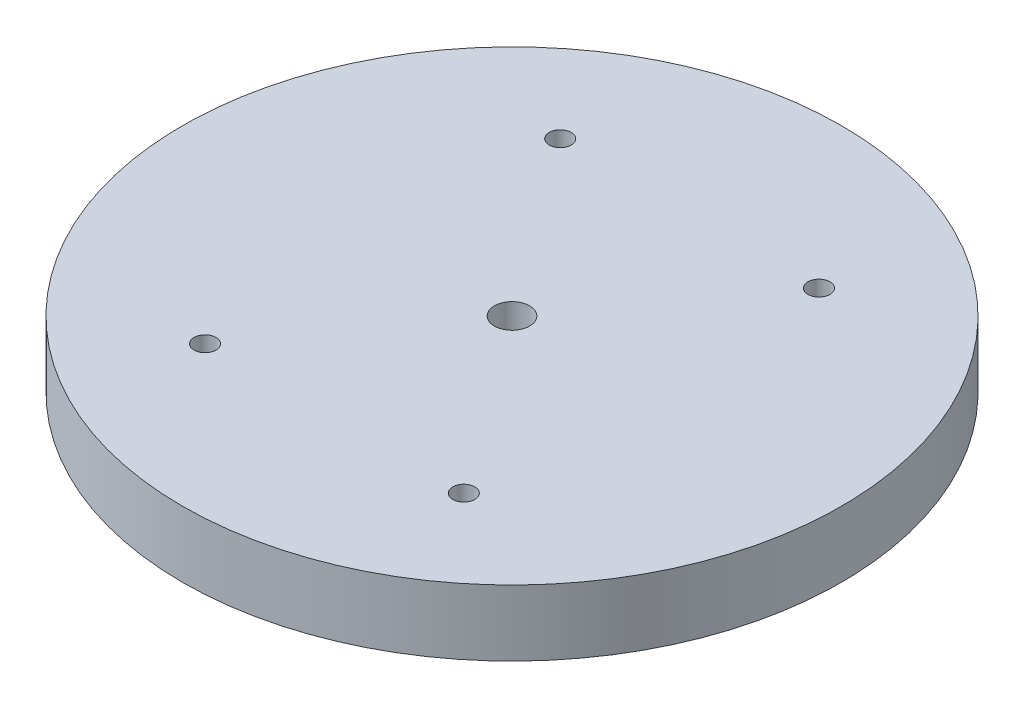
ISO-10303-21;
HEADER;
FILE_DESCRIPTION(('STEP AP214'),'2;1');
FILE_NAME('part.step','',(''),(''),'','','');
FILE_SCHEMA(('AUTOMOTIVE_DESIGN { 1 0 10303 214 1 1 1 1 }'));
ENDSEC;
DATA;
#1=APPLICATION_CONTEXT('core data for automotive mechanical design processes');
#2=APPLICATION_PROTOCOL_DEFINITION('international standard','automotive_design',2000,#1);
#3=PRODUCT_CONTEXT('',#1,'mechanical');
#4=PRODUCT('Part','Part','',(#3));
#5=PRODUCT_RELATED_PRODUCT_CATEGORY('part','',(#4));
#6=PRODUCT_DEFINITION_FORMATION('','',#4);
#7=PRODUCT_DEFINITION_CONTEXT('part definition',#1,'design');
#8=PRODUCT_DEFINITION('design','',#6,#7);
#9=PRODUCT_DEFINITION_SHAPE('','',#8);
#10=(LENGTH_UNIT() NAMED_UNIT(*) SI_UNIT(.MILLI.,.METRE.));
#11=(NAMED_UNIT(*) PLANE_ANGLE_UNIT() SI_UNIT($,.RADIAN.));
#12=(NAMED_UNIT(*) SI_UNIT($,.STERADIAN.) SOLID_ANGLE_UNIT());
#13=UNCERTAINTY_MEASURE_WITH_UNIT(LENGTH_MEASURE(1.E-05),#10,'distance_accuracy_value','');
#14=(GEOMETRIC_REPRESENTATION_CONTEXT(3) GLOBAL_UNCERTAINTY_ASSIGNED_CONTEXT((#13)) GLOBAL_UNIT_ASSIGNED_CONTEXT((#10,
#11,#12)) REPRESENTATION_CONTEXT('',''));
#15=CARTESIAN_POINT('',(0.,0.,0.));
#16=DIRECTION('',(0.,0.,1.));
#17=DIRECTION('',(1.,0.,0.));
#18=AXIS2_PLACEMENT_3D('',#15,#16,#17);
#19=CARTESIAN_POINT('',(0.,15.,0.));
#20=DIRECTION('',(0.,1.,0.));
#21=DIRECTION('',(0.,0.,1.));
#22=AXIS2_PLACEMENT_3D('',#19,#20,#21);
#23=PLANE('',#22);
#24=CARTESIAN_POINT('',(0.,15.,0.));
#25=DIRECTION('',(0.,1.,0.));
#26=DIRECTION('',(0.,0.,1.));
#27=AXIS2_PLACEMENT_3D('',#24,#25,#26);
#28=CIRCLE('',#27,4.);
#29=CARTESIAN_POINT('',(0.,15.,4.));
#30=VERTEX_POINT('',#29);
#31=EDGE_CURVE('E73',#30,#30,#28,.T.);
#32=ORIENTED_EDGE('',*,*,#31,.F.);
#33=EDGE_LOOP('',(#32));
#34=FACE_BOUND('',#33,.T.);
#35=CARTESIAN_POINT('',(-29.4435878552393,15.,40.4113243313159));
#36=DIRECTION('',(0.,1.,0.));
#37=DIRECTION('',(0.,0.,1.));
#38=AXIS2_PLACEMENT_3D('',#35,#36,#37);
#39=CIRCLE('',#38,2.5);
#40=CARTESIAN_POINT('',(-29.4435878552393,15.,42.9113243313159));
#41=VERTEX_POINT('',#40);
#42=EDGE_CURVE('E59',#41,#41,#39,.T.);
#43=ORIENTED_EDGE('',*,*,#42,.F.);
#44=EDGE_LOOP('',(#43));
#45=FACE_BOUND('',#44,.T.);
#46=CARTESIAN_POINT('',(29.4435878552393,15.,-40.4113243313159));
#47=DIRECTION('',(0.,1.,0.));
#48=DIRECTION('',(0.,0.,1.));
#49=AXIS2_PLACEMENT_3D('',#46,#47,#48);
#50=CIRCLE('',#49,2.50000000000001);
#51=CARTESIAN_POINT('',(29.4435878552393,15.,-37.9113243313159));
#52=VERTEX_POINT('',#51);
#53=EDGE_CURVE('E48',#52,#52,#50,.T.);
#54=ORIENTED_EDGE('',*,*,#53,.F.);
#55=EDGE_LOOP('',(#54));
#56=FACE_BOUND('',#55,.T.);
#57=CARTESIAN_POINT('',(0.,15.,0.));
#58=DIRECTION('',(0.,1.,0.));
#59=DIRECTION('',(0.,0.,1.));
#60=AXIS2_PLACEMENT_3D('',#57,#58,#59);
#61=CIRCLE('',#60,75.);
#62=CARTESIAN_POINT('',(0.,15.,75.));
#63=VERTEX_POINT('',#62);
#64=EDGE_CURVE('E10',#63,#63,#61,.T.);
#65=ORIENTED_EDGE('',*,*,#64,.T.);
#66=EDGE_LOOP('',(#65));
#67=FACE_BOUND('',#66,.T.);
#68=CARTESIAN_POINT('',(29.4435878552393,15.,40.4113243313159));
#69=DIRECTION('',(0.,1.,0.));
#70=DIRECTION('',(0.,0.,-1.));
#71=AXIS2_PLACEMENT_3D('',#68,#69,#70);
#72=CIRCLE('',#71,2.50000000000001);
#73=CARTESIAN_POINT('',(29.4435878552393,15.,37.9113243313159));
#74=VERTEX_POINT('',#73);
#75=EDGE_CURVE('E53',#74,#74,#72,.T.);
#76=ORIENTED_EDGE('',*,*,#75,.F.);
#77=EDGE_LOOP('',(#76));
#78=FACE_BOUND('',#77,.T.);
#79=CARTESIAN_POINT('',(-29.4435878552393,15.,-40.4113243313159));
#80=DIRECTION('',(0.,1.,0.));
#81=DIRECTION('',(0.,0.,-1.));
#82=AXIS2_PLACEMENT_3D('',#79,#80,#81);
#83=CIRCLE('',#82,2.5);
#84=CARTESIAN_POINT('',(-29.4435878552393,15.,-42.9113243313159));
#85=VERTEX_POINT('',#84);
#86=EDGE_CURVE('E65',#85,#85,#83,.T.);
#87=ORIENTED_EDGE('',*,*,#86,.F.);
#88=EDGE_LOOP('',(#87));
#89=FACE_BOUND('',#88,.T.);
#90=ADVANCED_FACE('F35',(#34,#45,#56,#67,#78,#89),#23,.T.);
#91=CARTESIAN_POINT('',(0.,0.,0.));
#92=DIRECTION('',(0.,1.,0.));
#93=DIRECTION('',(0.,0.,1.));
#94=AXIS2_PLACEMENT_3D('',#91,#92,#93);
#95=PLANE('',#94);
#96=CARTESIAN_POINT('',(0.,0.,0.));
#97=DIRECTION('',(0.,1.,0.));
#98=DIRECTION('',(0.,0.,1.));
#99=AXIS2_PLACEMENT_3D('',#96,#97,#98);
#100=CIRCLE('',#99,4.);
#101=CARTESIAN_POINT('',(0.,0.,4.));
#102=VERTEX_POINT('',#101);
#103=EDGE_CURVE('E39',#102,#102,#100,.T.);
#104=ORIENTED_EDGE('',*,*,#103,.T.);
#105=EDGE_LOOP('',(#104));
#106=FACE_BOUND('',#105,.T.);
#107=CARTESIAN_POINT('',(0.,0.,0.));
#108=DIRECTION('',(0.,1.,0.));
#109=DIRECTION('',(0.,0.,1.));
#110=AXIS2_PLACEMENT_3D('',#107,#108,#109);
#111=CIRCLE('',#110,75.);
#112=CARTESIAN_POINT('',(0.,0.,75.));
#113=VERTEX_POINT('',#112);
#114=EDGE_CURVE('E43',#113,#113,#111,.T.);
#115=ORIENTED_EDGE('',*,*,#114,.F.);
#116=EDGE_LOOP('',(#115));
#117=FACE_BOUND('',#116,.T.);
#118=CARTESIAN_POINT('',(29.4435878552393,0.,-40.4113243313159));
#119=DIRECTION('',(0.,1.,0.));
#120=DIRECTION('',(0.,0.,1.));
#121=AXIS2_PLACEMENT_3D('',#118,#119,#120);
#122=CIRCLE('',#121,2.50000000000001);
#123=CARTESIAN_POINT('',(29.4435878552393,0.,-37.9113243313159));
#124=VERTEX_POINT('',#123);
#125=EDGE_CURVE('E50',#124,#124,#122,.T.);
#126=ORIENTED_EDGE('',*,*,#125,.T.);
#127=EDGE_LOOP('',(#126));
#128=FACE_BOUND('',#127,.T.);
#129=CARTESIAN_POINT('',(29.4435878552393,0.,40.4113243313159));
#130=DIRECTION('',(0.,1.,0.));
#131=DIRECTION('',(0.,0.,-1.));
#132=AXIS2_PLACEMENT_3D('',#129,#130,#131);
#133=CIRCLE('',#132,2.50000000000001);
#134=CARTESIAN_POINT('',(29.4435878552393,0.,37.9113243313159));
#135=VERTEX_POINT('',#134);
#136=EDGE_CURVE('E56',#135,#135,#133,.T.);
#137=ORIENTED_EDGE('',*,*,#136,.T.);
#138=EDGE_LOOP('',(#137));
#139=FACE_BOUND('',#138,.T.);
#140=CARTESIAN_POINT('',(-29.4435878552393,0.,40.4113243313159));
#141=DIRECTION('',(0.,1.,0.));
#142=DIRECTION('',(0.,0.,1.));
#143=AXIS2_PLACEMENT_3D('',#140,#141,#142);
#144=CIRCLE('',#143,2.5);
#145=CARTESIAN_POINT('',(-29.4435878552393,0.,42.9113243313159));
#146=VERTEX_POINT('',#145);
#147=EDGE_CURVE('E62',#146,#146,#144,.T.);
#148=ORIENTED_EDGE('',*,*,#147,.T.);
#149=EDGE_LOOP('',(#148));
#150=FACE_BOUND('',#149,.T.);
#151=CARTESIAN_POINT('',(-29.4435878552393,0.,-40.4113243313159));
#152=DIRECTION('',(0.,1.,0.));
#153=DIRECTION('',(0.,0.,-1.));
#154=AXIS2_PLACEMENT_3D('',#151,#152,#153);
#155=CIRCLE('',#154,2.5);
#156=CARTESIAN_POINT('',(-29.4435878552393,0.,-42.9113243313159));
#157=VERTEX_POINT('',#156);
#158=EDGE_CURVE('E68',#157,#157,#155,.T.);
#159=ORIENTED_EDGE('',*,*,#158,.T.);
#160=EDGE_LOOP('',(#159));
#161=FACE_BOUND('',#160,.T.);
#162=ADVANCED_FACE('F80',(#106,#117,#128,#139,#150,#161),#95,.F.);
#163=CARTESIAN_POINT('',(0.,15.,0.));
#164=DIRECTION('',(0.,-1.,0.));
#165=DIRECTION('',(0.,0.,-1.));
#166=AXIS2_PLACEMENT_3D('',#163,#164,#165);
#167=CYLINDRICAL_SURFACE('',#166,75.);
#168=ORIENTED_EDGE('',*,*,#64,.F.);
#169=EDGE_LOOP('',(#168));
#170=FACE_BOUND('',#169,.T.);
#171=ORIENTED_EDGE('',*,*,#114,.T.);
#172=EDGE_LOOP('',(#171));
#173=FACE_BOUND('',#172,.T.);
#174=ADVANCED_FACE('F37',(#170,#173),#167,.T.);
#175=CARTESIAN_POINT('',(29.4435878552393,15.,-40.4113243313159));
#176=DIRECTION('',(0.,-1.,0.));
#177=DIRECTION('',(0.,0.,-1.));
#178=AXIS2_PLACEMENT_3D('',#175,#176,#177);
#179=CYLINDRICAL_SURFACE('',#178,2.50000000000001);
#180=ORIENTED_EDGE('',*,*,#53,.T.);
#181=EDGE_LOOP('',(#180));
#182=FACE_BOUND('',#181,.T.);
#183=ORIENTED_EDGE('',*,*,#125,.F.);
#184=EDGE_LOOP('',(#183));
#185=FACE_BOUND('',#184,.T.);
#186=ADVANCED_FACE('F101',(#182,#185),#179,.F.);
#187=CARTESIAN_POINT('',(29.4435878552393,15.,40.4113243313159));
#188=DIRECTION('',(0.,-1.,0.));
#189=DIRECTION('',(0.,0.,-1.));
#190=AXIS2_PLACEMENT_3D('',#187,#188,#189);
#191=CYLINDRICAL_SURFACE('',#190,2.50000000000001);
#192=ORIENTED_EDGE('',*,*,#75,.T.);
#193=EDGE_LOOP('',(#192));
#194=FACE_BOUND('',#193,.T.);
#195=ORIENTED_EDGE('',*,*,#136,.F.);
#196=EDGE_LOOP('',(#195));
#197=FACE_BOUND('',#196,.T.);
#198=ADVANCED_FACE('F104',(#194,#197),#191,.F.);
#199=CARTESIAN_POINT('',(-29.4435878552393,15.,40.4113243313159));
#200=DIRECTION('',(0.,-1.,0.));
#201=DIRECTION('',(0.,0.,-1.));
#202=AXIS2_PLACEMENT_3D('',#199,#200,#201);
#203=CYLINDRICAL_SURFACE('',#202,2.5);
#204=ORIENTED_EDGE('',*,*,#42,.T.);
#205=EDGE_LOOP('',(#204));
#206=FACE_BOUND('',#205,.T.);
#207=ORIENTED_EDGE('',*,*,#147,.F.);
#208=EDGE_LOOP('',(#207));
#209=FACE_BOUND('',#208,.T.);
#210=ADVANCED_FACE('F90',(#206,#209),#203,.F.);
#211=CARTESIAN_POINT('',(-29.4435878552393,15.,-40.4113243313159));
#212=DIRECTION('',(0.,-1.,0.));
#213=DIRECTION('',(0.,0.,-1.));
#214=AXIS2_PLACEMENT_3D('',#211,#212,#213);
#215=CYLINDRICAL_SURFACE('',#214,2.5);
#216=ORIENTED_EDGE('',*,*,#86,.T.);
#217=EDGE_LOOP('',(#216));
#218=FACE_BOUND('',#217,.T.);
#219=ORIENTED_EDGE('',*,*,#158,.F.);
#220=EDGE_LOOP('',(#219));
#221=FACE_BOUND('',#220,.T.);
#222=ADVANCED_FACE('F85',(#218,#221),#215,.F.);
#223=CARTESIAN_POINT('',(0.,-9.,0.));
#224=DIRECTION('',(0.,1.,0.));
#225=DIRECTION('',(0.,0.,1.));
#226=AXIS2_PLACEMENT_3D('',#223,#224,#225);
#227=CYLINDRICAL_SURFACE('',#226,4.);
#228=ORIENTED_EDGE('',*,*,#31,.T.);
#229=EDGE_LOOP('',(#228));
#230=FACE_BOUND('',#229,.T.);
#231=ORIENTED_EDGE('',*,*,#103,.F.);
#232=EDGE_LOOP('',(#231));
#233=FACE_BOUND('',#232,.T.);
#234=ADVANCED_FACE('F83',(#230,#233),#227,.F.);
#235=CLOSED_SHELL('',(#90,#162,#174,#186,#198,#210,#222,#234));
#236=MANIFOLD_SOLID_BREP('B2',#235);
#237=ADVANCED_BREP_SHAPE_REPRESENTATION('',(#18,#236),#14);
#238=SHAPE_DEFINITION_REPRESENTATION(#9,#237);
ENDSEC;
END-ISO-10303-21;
